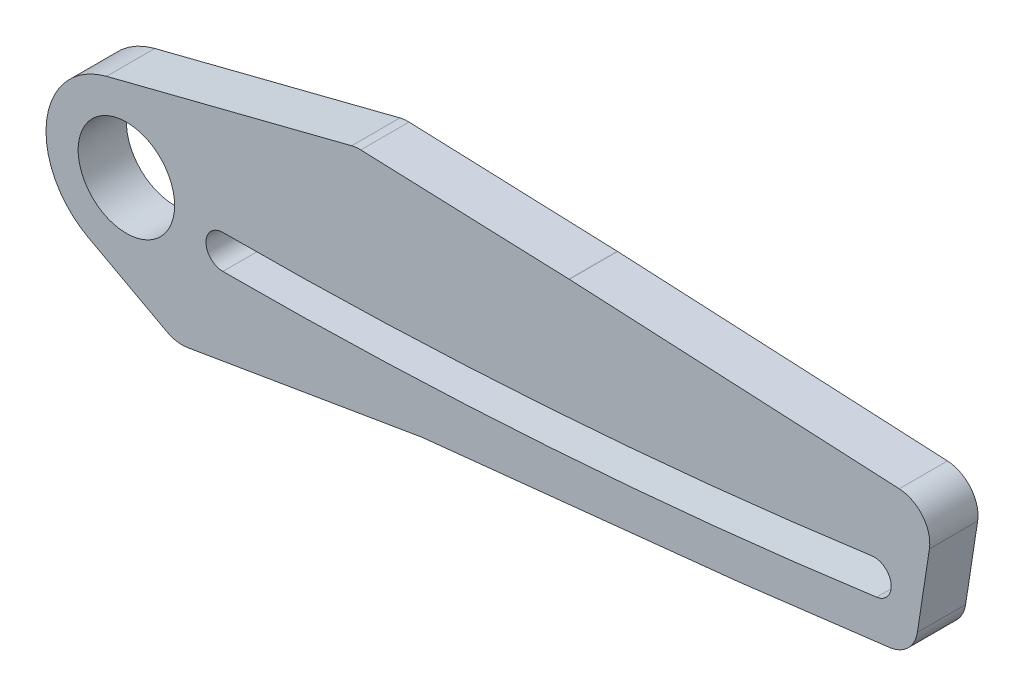
ISO-10303-21;
HEADER;
FILE_DESCRIPTION(('STEP AP214'),'2;1');
FILE_NAME('part.step','',(''),(''),'','','');
FILE_SCHEMA(('AUTOMOTIVE_DESIGN { 1 0 10303 214 1 1 1 1 }'));
ENDSEC;
DATA;
#1=APPLICATION_CONTEXT('core data for automotive mechanical design processes');
#2=APPLICATION_PROTOCOL_DEFINITION('international standard','automotive_design',2000,#1);
#3=PRODUCT_CONTEXT('',#1,'mechanical');
#4=PRODUCT('Part','Part','',(#3));
#5=PRODUCT_RELATED_PRODUCT_CATEGORY('part','',(#4));
#6=PRODUCT_DEFINITION_FORMATION('','',#4);
#7=PRODUCT_DEFINITION_CONTEXT('part definition',#1,'design');
#8=PRODUCT_DEFINITION('design','',#6,#7);
#9=PRODUCT_DEFINITION_SHAPE('','',#8);
#10=(LENGTH_UNIT() NAMED_UNIT(*) SI_UNIT(.MILLI.,.METRE.));
#11=(NAMED_UNIT(*) PLANE_ANGLE_UNIT() SI_UNIT($,.RADIAN.));
#12=(NAMED_UNIT(*) SI_UNIT($,.STERADIAN.) SOLID_ANGLE_UNIT());
#13=UNCERTAINTY_MEASURE_WITH_UNIT(LENGTH_MEASURE(1.E-05),#10,'distance_accuracy_value','');
#14=(GEOMETRIC_REPRESENTATION_CONTEXT(3) GLOBAL_UNCERTAINTY_ASSIGNED_CONTEXT((#13)) GLOBAL_UNIT_ASSIGNED_CONTEXT((#10,
#11,#12)) REPRESENTATION_CONTEXT('',''));
#15=CARTESIAN_POINT('',(0.,0.,0.));
#16=DIRECTION('',(0.,0.,1.));
#17=DIRECTION('',(1.,0.,0.));
#18=AXIS2_PLACEMENT_3D('',#15,#16,#17);
#19=CARTESIAN_POINT('',(0.,0.,1.5));
#20=DIRECTION('',(0.,0.,1.));
#21=DIRECTION('',(1.,0.,0.));
#22=AXIS2_PLACEMENT_3D('',#19,#20,#21);
#23=PLANE('',#22);
#24=CARTESIAN_POINT('',(5.99999999999999,-1.,1.5));
#25=DIRECTION('',(0.,0.,1.));
#26=DIRECTION('',(1.,0.,0.));
#27=AXIS2_PLACEMENT_3D('',#24,#25,#26);
#28=CIRCLE('',#27,1.05);
#29=CARTESIAN_POINT('',(5.99999999999995,0.0499999999999945,1.5));
#30=VERTEX_POINT('',#29);
#31=CARTESIAN_POINT('',(5.99999999999995,-2.05,1.5));
#32=VERTEX_POINT('',#31);
#33=EDGE_CURVE('E202',#30,#32,#28,.T.);
#34=ORIENTED_EDGE('',*,*,#33,.F.);
#35=CARTESIAN_POINT('',(6.,296.061931180591,1.5));
#36=DIRECTION('',(0.,0.,-1.));
#37=DIRECTION('',(1.,0.,0.));
#38=AXIS2_PLACEMENT_3D('',#35,#36,#37);
#39=CIRCLE('',#38,296.011931180591);
#40=CARTESIAN_POINT('',(46.3804692544966,2.81718509969425,1.5));
#41=VERTEX_POINT('',#40);
#42=EDGE_CURVE('E205',#41,#30,#39,.T.);
#43=ORIENTED_EDGE('',*,*,#42,.F.);
#44=CARTESIAN_POINT('',(46.5237050103937,1.77700073227061,1.5));
#45=DIRECTION('',(0.,0.,1.));
#46=DIRECTION('',(1.,0.,0.));
#47=AXIS2_PLACEMENT_3D('',#44,#45,#46);
#48=CIRCLE('',#47,1.04999999999997);
#49=CARTESIAN_POINT('',(46.6669407662909,0.736816364846959,1.5));
#50=VERTEX_POINT('',#49);
#51=EDGE_CURVE('E185',#50,#41,#48,.T.);
#52=ORIENTED_EDGE('',*,*,#51,.F.);
#53=CARTESIAN_POINT('',(6.,296.061931180591,1.5));
#54=DIRECTION('',(0.,0.,1.));
#55=DIRECTION('',(1.,0.,0.));
#56=AXIS2_PLACEMENT_3D('',#53,#54,#55);
#57=CIRCLE('',#56,298.111931180591);
#58=EDGE_CURVE('E196',#32,#50,#57,.T.);
#59=ORIENTED_EDGE('',*,*,#58,.F.);
#60=EDGE_LOOP('',(#34,#43,#52,#59));
#61=FACE_BOUND('',#60,.T.);
#62=DIRECTION('',(-0.999300114895373,0.0374069561725541,0.));
#63=VECTOR('',#62,1.);
#64=CARTESIAN_POINT('',(14.2922695517764,8.79851771367301,1.5));
#65=LINE('',#64,#63);
#66=CARTESIAN_POINT('',(27.5294378481649,8.30300874001141,1.5));
#67=VERTEX_POINT('',#66);
#68=CARTESIAN_POINT('',(14.580779216208,8.78771788666221,1.5));
#69=VERTEX_POINT('',#68);
#70=EDGE_CURVE('E224',#67,#69,#65,.T.);
#71=ORIENTED_EDGE('',*,*,#70,.T.);
#72=CARTESIAN_POINT('',(14.5059653038629,6.78911765687146,1.5));
#73=DIRECTION('',(0.,0.,1.));
#74=DIRECTION('',(1.,0.,0.));
#75=AXIS2_PLACEMENT_3D('',#72,#73,#74);
#76=CIRCLE('',#75,2.);
#77=CARTESIAN_POINT('',(14.0124843293526,8.72728084086716,1.5));
#78=VERTEX_POINT('',#77);
#79=EDGE_CURVE('E644',#69,#78,#76,.T.);
#80=ORIENTED_EDGE('',*,*,#79,.T.);
#81=DIRECTION('',(-0.969081591997847,-0.246740487255168,0.));
#82=VECTOR('',#81,1.);
#83=CARTESIAN_POINT('',(-1.23370243627584,4.84540795998924,1.5));
#84=LINE('',#83,#82);
#85=CARTESIAN_POINT('',(-1.23370243627584,4.84540795998924,1.5));
#86=VERTEX_POINT('',#85);
#87=EDGE_CURVE('E230',#78,#86,#84,.T.);
#88=ORIENTED_EDGE('',*,*,#87,.T.);
#89=CARTESIAN_POINT('',(0.,0.,1.5));
#90=DIRECTION('',(0.,0.,1.));
#91=DIRECTION('',(1.,0.,0.));
#92=AXIS2_PLACEMENT_3D('',#89,#90,#91);
#93=CIRCLE('',#92,5.);
#94=CARTESIAN_POINT('',(-2.37282278086079,-4.40110350373949,1.5));
#95=VERTEX_POINT('',#94);
#96=EDGE_CURVE('E245',#86,#95,#93,.T.);
#97=ORIENTED_EDGE('',*,*,#96,.T.);
#98=DIRECTION('',(0.880220700747899,-0.474564556172158,0.));
#99=VECTOR('',#98,1.);
#100=CARTESIAN_POINT('',(-2.37282278086079,-4.40110350373949,1.5));
#101=LINE('',#100,#99);
#102=CARTESIAN_POINT('',(2.51958718734579,-7.03881057334313,1.5));
#103=VERTEX_POINT('',#102);
#104=EDGE_CURVE('E250',#95,#103,#101,.T.);
#105=ORIENTED_EDGE('',*,*,#104,.T.);
#106=CARTESIAN_POINT('',(3.46871629969011,-5.27836917184733,1.5));
#107=DIRECTION('',(0.,0.,1.));
#108=DIRECTION('',(1.,0.,0.));
#109=AXIS2_PLACEMENT_3D('',#106,#107,#108);
#110=CIRCLE('',#109,2.);
#111=CARTESIAN_POINT('',(3.80141893230588,-7.25050227036034,1.5));
#112=VERTEX_POINT('',#111);
#113=EDGE_CURVE('E277',#103,#112,#110,.T.);
#114=ORIENTED_EDGE('',*,*,#113,.T.);
#115=DIRECTION('',(0.986066549256506,0.166351316307887,0.));
#116=VECTOR('',#115,1.);
#117=CARTESIAN_POINT('',(3.12415373345867,-7.36475820714545,1.5));
#118=LINE('',#117,#116);
#119=CARTESIAN_POINT('',(18.3225468306483,-4.80076016929646,1.5));
#120=VERTEX_POINT('',#119);
#121=EDGE_CURVE('E257',#112,#120,#118,.T.);
#122=ORIENTED_EDGE('',*,*,#121,.T.);
#123=CARTESIAN_POINT('',(18.6552494632641,-6.77289326780947,1.5));
#124=DIRECTION('',(0.,0.,1.));
#125=DIRECTION('',(1.,0.,0.));
#126=AXIS2_PLACEMENT_3D('',#123,#124,#125);
#127=CIRCLE('',#126,2.);
#128=CARTESIAN_POINT('',(18.4469429976877,-4.78377074357949,1.5));
#129=VERTEX_POINT('',#128);
#130=EDGE_CURVE('E12',#120,#129,#127,.F.);
#131=ORIENTED_EDGE('',*,*,#130,.T.);
#132=DIRECTION('',(0.99456126211499,0.104153232788223,0.));
#133=VECTOR('',#132,1.);
#134=CARTESIAN_POINT('',(38.114277377156,-2.72415256421011,1.5));
#135=LINE('',#134,#133);
#136=CARTESIAN_POINT('',(38.0962005888889,-2.72604561595882,1.5));
#137=VERTEX_POINT('',#136);
#138=EDGE_CURVE('E262',#129,#137,#135,.T.);
#139=ORIENTED_EDGE('',*,*,#138,.T.);
#140=CARTESIAN_POINT('',(37.8878941233125,-0.736923091728843,1.5));
#141=DIRECTION('',(0.,0.,1.));
#142=DIRECTION('',(1.,0.,0.));
#143=AXIS2_PLACEMENT_3D('',#140,#141,#142);
#144=CIRCLE('',#143,2.);
#145=CARTESIAN_POINT('',(38.1323167752135,-2.72193129504632,1.5));
#146=VERTEX_POINT('',#145);
#147=EDGE_CURVE('E272',#137,#146,#144,.T.);
#148=ORIENTED_EDGE('',*,*,#147,.T.);
#149=DIRECTION('',(0.992504101658737,0.122211325950516,0.));
#150=VECTOR('',#149,1.);
#151=CARTESIAN_POINT('',(48.9717438907301,-1.38722571738943,1.5));
#152=LINE('',#151,#150);
#153=CARTESIAN_POINT('',(47.4691413970144,-1.57224766624249,1.5));
#154=VERTEX_POINT('',#153);
#155=EDGE_CURVE('E291',#146,#154,#152,.T.);
#156=ORIENTED_EDGE('',*,*,#155,.T.);
#157=CARTESIAN_POINT('',(47.2247187451133,0.412760537074988,1.5));
#158=DIRECTION('',(0.,0.,1.));
#159=DIRECTION('',(1.,0.,0.));
#160=AXIS2_PLACEMENT_3D('',#157,#158,#159);
#161=CIRCLE('',#160,2.);
#162=CARTESIAN_POINT('',(49.2015446519817,0.109182978724819,1.5));
#163=VERTEX_POINT('',#162);
#164=EDGE_CURVE('E276',#154,#163,#161,.T.);
#165=ORIENTED_EDGE('',*,*,#164,.T.);
#166=DIRECTION('',(0.151788779175085,0.98841295343421,0.));
#167=VECTOR('',#166,1.);
#168=CARTESIAN_POINT('',(50.2856916724055,7.16889427120359,1.5));
#169=LINE('',#168,#167);
#170=CARTESIAN_POINT('',(49.9492609586932,4.97813631680483,1.5));
#171=VERTEX_POINT('',#170);
#172=EDGE_CURVE('E288',#163,#171,#169,.T.);
#173=ORIENTED_EDGE('',*,*,#172,.T.);
#174=CARTESIAN_POINT('',(47.9724350518248,5.281713875155,1.5));
#175=DIRECTION('',(0.,0.,1.));
#176=DIRECTION('',(1.,0.,0.));
#177=AXIS2_PLACEMENT_3D('',#174,#175,#176);
#178=CIRCLE('',#177,2.);
#179=CARTESIAN_POINT('',(48.0719999202041,7.27923404701425,1.5));
#180=VERTEX_POINT('',#179);
#181=EDGE_CURVE('E64',#171,#180,#178,.T.);
#182=ORIENTED_EDGE('',*,*,#181,.T.);
#183=DIRECTION('',(-0.998760085929626,0.0497824341896386,0.));
#184=VECTOR('',#183,1.);
#185=CARTESIAN_POINT('',(27.5418166709843,8.3025453616171,1.5));
#186=LINE('',#185,#184);
#187=CARTESIAN_POINT('',(27.5541888041991,8.30192868207992,1.5));
#188=VERTEX_POINT('',#187);
#189=EDGE_CURVE('E231',#180,#188,#186,.T.);
#190=ORIENTED_EDGE('',*,*,#189,.T.);
#191=CARTESIAN_POINT('',(27.4546239358198,6.30440851022067,1.5));
#192=DIRECTION('',(0.,0.,1.));
#193=DIRECTION('',(1.,0.,0.));
#194=AXIS2_PLACEMENT_3D('',#191,#192,#193);
#195=CIRCLE('',#194,2.);
#196=EDGE_CURVE('E642',#188,#67,#195,.T.);
#197=ORIENTED_EDGE('',*,*,#196,.T.);
#198=EDGE_LOOP('',(#71,#80,#88,#97,#105,#114,#122,#131,#139,#148,#156,#165,#173,#182,#190,#197));
#199=FACE_BOUND('',#198,.T.);
#200=CARTESIAN_POINT('',(0.,0.,1.5));
#201=DIRECTION('',(0.,0.,1.));
#202=DIRECTION('',(1.,0.,0.));
#203=AXIS2_PLACEMENT_3D('',#200,#201,#202);
#204=CIRCLE('',#203,3.);
#205=CARTESIAN_POINT('',(3.,0.,1.5));
#206=VERTEX_POINT('',#205);
#207=EDGE_CURVE('E411',#206,#206,#204,.T.);
#208=ORIENTED_EDGE('',*,*,#207,.F.);
#209=EDGE_LOOP('',(#208));
#210=FACE_BOUND('',#209,.T.);
#211=ADVANCED_FACE('F41',(#61,#199,#210),#23,.T.);
#212=CARTESIAN_POINT('',(0.,0.,-1.5));
#213=DIRECTION('',(0.,0.,1.));
#214=DIRECTION('',(1.,0.,0.));
#215=AXIS2_PLACEMENT_3D('',#212,#213,#214);
#216=PLANE('',#215);
#217=CARTESIAN_POINT('',(6.,296.061931180591,-1.5));
#218=DIRECTION('',(0.,0.,1.));
#219=DIRECTION('',(1.,0.,0.));
#220=AXIS2_PLACEMENT_3D('',#217,#218,#219);
#221=CIRCLE('',#220,296.011931180591);
#222=CARTESIAN_POINT('',(46.3804692544966,2.81718509969425,-1.5));
#223=VERTEX_POINT('',#222);
#224=CARTESIAN_POINT('',(5.99999999999995,0.0499999999999945,-1.5));
#225=VERTEX_POINT('',#224);
#226=EDGE_CURVE('E375',#223,#225,#221,.F.);
#227=ORIENTED_EDGE('',*,*,#226,.T.);
#228=CARTESIAN_POINT('',(5.99999999999999,-1.,-1.5));
#229=DIRECTION('',(0.,0.,1.));
#230=DIRECTION('',(1.,0.,0.));
#231=AXIS2_PLACEMENT_3D('',#228,#229,#230);
#232=CIRCLE('',#231,1.05);
#233=CARTESIAN_POINT('',(5.99999999999995,-2.05,-1.5));
#234=VERTEX_POINT('',#233);
#235=EDGE_CURVE('E378',#225,#234,#232,.T.);
#236=ORIENTED_EDGE('',*,*,#235,.T.);
#237=CARTESIAN_POINT('',(6.,296.061931180591,-1.5));
#238=DIRECTION('',(0.,0.,1.));
#239=DIRECTION('',(1.,0.,0.));
#240=AXIS2_PLACEMENT_3D('',#237,#238,#239);
#241=CIRCLE('',#240,298.111931180591);
#242=CARTESIAN_POINT('',(46.6669407662909,0.736816364846959,-1.5));
#243=VERTEX_POINT('',#242);
#244=EDGE_CURVE('E372',#234,#243,#241,.T.);
#245=ORIENTED_EDGE('',*,*,#244,.T.);
#246=CARTESIAN_POINT('',(46.5237050103937,1.77700073227061,-1.5));
#247=DIRECTION('',(0.,0.,1.));
#248=DIRECTION('',(1.,0.,0.));
#249=AXIS2_PLACEMENT_3D('',#246,#247,#248);
#250=CIRCLE('',#249,1.04999999999997);
#251=EDGE_CURVE('E188',#243,#223,#250,.T.);
#252=ORIENTED_EDGE('',*,*,#251,.T.);
#253=EDGE_LOOP('',(#227,#236,#245,#252));
#254=FACE_BOUND('',#253,.T.);
#255=DIRECTION('',(-0.969081591997847,-0.246740487255168,0.));
#256=VECTOR('',#255,1.);
#257=CARTESIAN_POINT('',(-1.23370243627584,4.84540795998924,-1.5));
#258=LINE('',#257,#256);
#259=CARTESIAN_POINT('',(14.0124843293526,8.72728084086716,-1.5));
#260=VERTEX_POINT('',#259);
#261=CARTESIAN_POINT('',(-1.23370243627584,4.84540795998924,-1.5));
#262=VERTEX_POINT('',#261);
#263=EDGE_CURVE('E251',#260,#262,#258,.T.);
#264=ORIENTED_EDGE('',*,*,#263,.F.);
#265=CARTESIAN_POINT('',(14.5059653038629,6.78911765687146,-1.5));
#266=DIRECTION('',(0.,0.,1.));
#267=DIRECTION('',(1.,0.,0.));
#268=AXIS2_PLACEMENT_3D('',#265,#266,#267);
#269=CIRCLE('',#268,2.);
#270=CARTESIAN_POINT('',(14.580779216208,8.78771788666221,-1.5));
#271=VERTEX_POINT('',#270);
#272=EDGE_CURVE('E393',#260,#271,#269,.F.);
#273=ORIENTED_EDGE('',*,*,#272,.T.);
#274=DIRECTION('',(-0.999300114895373,0.0374069561725541,0.));
#275=VECTOR('',#274,1.);
#276=CARTESIAN_POINT('',(14.2922695517764,8.79851771367301,-1.5));
#277=LINE('',#276,#275);
#278=CARTESIAN_POINT('',(27.5294378481649,8.30300874001141,-1.5));
#279=VERTEX_POINT('',#278);
#280=EDGE_CURVE('E363',#279,#271,#277,.T.);
#281=ORIENTED_EDGE('',*,*,#280,.F.);
#282=CARTESIAN_POINT('',(27.4546239358198,6.30440851022067,-1.5));
#283=DIRECTION('',(0.,0.,1.));
#284=DIRECTION('',(1.,0.,0.));
#285=AXIS2_PLACEMENT_3D('',#282,#283,#284);
#286=CIRCLE('',#285,2.);
#287=CARTESIAN_POINT('',(27.5541888041991,8.30192868207992,-1.5));
#288=VERTEX_POINT('',#287);
#289=EDGE_CURVE('E391',#279,#288,#286,.F.);
#290=ORIENTED_EDGE('',*,*,#289,.T.);
#291=DIRECTION('',(-0.998760085929626,0.0497824341896386,0.));
#292=VECTOR('',#291,1.);
#293=CARTESIAN_POINT('',(27.5418166709843,8.3025453616171,-1.5));
#294=LINE('',#293,#292);
#295=CARTESIAN_POINT('',(48.0719999202041,7.27923404701425,-1.5));
#296=VERTEX_POINT('',#295);
#297=EDGE_CURVE('E361',#296,#288,#294,.T.);
#298=ORIENTED_EDGE('',*,*,#297,.F.);
#299=CARTESIAN_POINT('',(47.9724350518248,5.281713875155,-1.5));
#300=DIRECTION('',(0.,0.,1.));
#301=DIRECTION('',(1.,0.,0.));
#302=AXIS2_PLACEMENT_3D('',#299,#300,#301);
#303=CIRCLE('',#302,2.);
#304=CARTESIAN_POINT('',(49.9492609586932,4.97813631680483,-1.5));
#305=VERTEX_POINT('',#304);
#306=EDGE_CURVE('E389',#296,#305,#303,.F.);
#307=ORIENTED_EDGE('',*,*,#306,.T.);
#308=DIRECTION('',(0.151788779175085,0.98841295343421,0.));
#309=VECTOR('',#308,1.);
#310=CARTESIAN_POINT('',(50.2856916724055,7.16889427120359,-1.5));
#311=LINE('',#310,#309);
#312=CARTESIAN_POINT('',(49.2015446519817,0.109182978724819,-1.5));
#313=VERTEX_POINT('',#312);
#314=EDGE_CURVE('E356',#313,#305,#311,.T.);
#315=ORIENTED_EDGE('',*,*,#314,.F.);
#316=CARTESIAN_POINT('',(47.2247187451133,0.412760537074988,-1.5));
#317=DIRECTION('',(0.,0.,1.));
#318=DIRECTION('',(1.,0.,0.));
#319=AXIS2_PLACEMENT_3D('',#316,#317,#318);
#320=CIRCLE('',#319,2.);
#321=CARTESIAN_POINT('',(47.4691413970144,-1.57224766624249,-1.5));
#322=VERTEX_POINT('',#321);
#323=EDGE_CURVE('E387',#313,#322,#320,.F.);
#324=ORIENTED_EDGE('',*,*,#323,.T.);
#325=DIRECTION('',(0.992504101658737,0.122211325950516,0.));
#326=VECTOR('',#325,1.);
#327=CARTESIAN_POINT('',(48.9717438907301,-1.38722571738943,-1.5));
#328=LINE('',#327,#326);
#329=CARTESIAN_POINT('',(38.1323167752135,-2.72193129504632,-1.5));
#330=VERTEX_POINT('',#329);
#331=EDGE_CURVE('E354',#330,#322,#328,.T.);
#332=ORIENTED_EDGE('',*,*,#331,.F.);
#333=CARTESIAN_POINT('',(37.8878941233125,-0.736923091728843,-1.5));
#334=DIRECTION('',(0.,0.,1.));
#335=DIRECTION('',(1.,0.,0.));
#336=AXIS2_PLACEMENT_3D('',#333,#334,#335);
#337=CIRCLE('',#336,2.);
#338=CARTESIAN_POINT('',(38.0962005888889,-2.72604561595882,-1.5));
#339=VERTEX_POINT('',#338);
#340=EDGE_CURVE('E313',#330,#339,#337,.F.);
#341=ORIENTED_EDGE('',*,*,#340,.T.);
#342=DIRECTION('',(0.99456126211499,0.104153232788223,0.));
#343=VECTOR('',#342,1.);
#344=CARTESIAN_POINT('',(38.114277377156,-2.72415256421011,-1.5));
#345=LINE('',#344,#343);
#346=CARTESIAN_POINT('',(18.4469429976877,-4.78377074357949,-1.5));
#347=VERTEX_POINT('',#346);
#348=EDGE_CURVE('E343',#347,#339,#345,.T.);
#349=ORIENTED_EDGE('',*,*,#348,.F.);
#350=CARTESIAN_POINT('',(18.6552494632641,-6.77289326780947,-1.5));
#351=DIRECTION('',(0.,0.,1.));
#352=DIRECTION('',(1.,0.,0.));
#353=AXIS2_PLACEMENT_3D('',#350,#351,#352);
#354=CIRCLE('',#353,2.);
#355=CARTESIAN_POINT('',(18.3225468306483,-4.80076016929646,-1.5));
#356=VERTEX_POINT('',#355);
#357=EDGE_CURVE('E50',#347,#356,#354,.T.);
#358=ORIENTED_EDGE('',*,*,#357,.T.);
#359=DIRECTION('',(0.986066549256506,0.166351316307887,0.));
#360=VECTOR('',#359,1.);
#361=CARTESIAN_POINT('',(3.12415373345867,-7.36475820714545,-1.5));
#362=LINE('',#361,#360);
#363=CARTESIAN_POINT('',(3.80141893230588,-7.25050227036034,-1.5));
#364=VERTEX_POINT('',#363);
#365=EDGE_CURVE('E341',#364,#356,#362,.T.);
#366=ORIENTED_EDGE('',*,*,#365,.F.);
#367=CARTESIAN_POINT('',(3.46871629969011,-5.27836917184733,-1.5));
#368=DIRECTION('',(0.,0.,1.));
#369=DIRECTION('',(1.,0.,0.));
#370=AXIS2_PLACEMENT_3D('',#367,#368,#369);
#371=CIRCLE('',#370,2.);
#372=CARTESIAN_POINT('',(2.51958718734579,-7.03881057334313,-1.5));
#373=VERTEX_POINT('',#372);
#374=EDGE_CURVE('E384',#364,#373,#371,.F.);
#375=ORIENTED_EDGE('',*,*,#374,.T.);
#376=DIRECTION('',(0.880220700747899,-0.474564556172158,0.));
#377=VECTOR('',#376,1.);
#378=CARTESIAN_POINT('',(-2.37282278086079,-4.40110350373949,-1.5));
#379=LINE('',#378,#377);
#380=CARTESIAN_POINT('',(-2.37282278086079,-4.40110350373949,-1.5));
#381=VERTEX_POINT('',#380);
#382=EDGE_CURVE('E350',#381,#373,#379,.T.);
#383=ORIENTED_EDGE('',*,*,#382,.F.);
#384=CARTESIAN_POINT('',(0.,0.,-1.5));
#385=DIRECTION('',(0.,0.,1.));
#386=DIRECTION('',(1.,0.,0.));
#387=AXIS2_PLACEMENT_3D('',#384,#385,#386);
#388=CIRCLE('',#387,5.);
#389=EDGE_CURVE('E238',#262,#381,#388,.T.);
#390=ORIENTED_EDGE('',*,*,#389,.F.);
#391=EDGE_LOOP('',(#264,#273,#281,#290,#298,#307,#315,#324,#332,#341,#349,#358,#366,#375,#383,#390));
#392=FACE_BOUND('',#391,.T.);
#393=CARTESIAN_POINT('',(0.,0.,-1.5));
#394=DIRECTION('',(0.,0.,1.));
#395=DIRECTION('',(1.,0.,0.));
#396=AXIS2_PLACEMENT_3D('',#393,#394,#395);
#397=CIRCLE('',#396,3.);
#398=CARTESIAN_POINT('',(3.,0.,-1.5));
#399=VERTEX_POINT('',#398);
#400=EDGE_CURVE('E252',#399,#399,#397,.T.);
#401=ORIENTED_EDGE('',*,*,#400,.T.);
#402=EDGE_LOOP('',(#401));
#403=FACE_BOUND('',#402,.T.);
#404=ADVANCED_FACE('F339',(#254,#392,#403),#216,.F.);
#405=CARTESIAN_POINT('',(0.,0.,1.5));
#406=DIRECTION('',(0.,0.,-1.));
#407=DIRECTION('',(-1.,0.,0.));
#408=AXIS2_PLACEMENT_3D('',#405,#406,#407);
#409=CYLINDRICAL_SURFACE('',#408,5.);
#410=ORIENTED_EDGE('',*,*,#389,.T.);
#411=DIRECTION('',(0.,0.,-1.));
#412=VECTOR('',#411,1.);
#413=CARTESIAN_POINT('',(-2.37282278086079,-4.40110350373949,1.5));
#414=LINE('',#413,#412);
#415=EDGE_CURVE('E369',#95,#381,#414,.T.);
#416=ORIENTED_EDGE('',*,*,#415,.F.);
#417=ORIENTED_EDGE('',*,*,#96,.F.);
#418=DIRECTION('',(0.,0.,-1.));
#419=VECTOR('',#418,1.);
#420=CARTESIAN_POINT('',(-1.23370243627584,4.84540795998924,1.5));
#421=LINE('',#420,#419);
#422=EDGE_CURVE('E237',#86,#262,#421,.T.);
#423=ORIENTED_EDGE('',*,*,#422,.T.);
#424=EDGE_LOOP('',(#410,#416,#417,#423));
#425=FACE_BOUND('',#424,.T.);
#426=ADVANCED_FACE('F432',(#425),#409,.T.);
#427=CARTESIAN_POINT('',(-2.37282278086079,-4.40110350373949,1.5));
#428=DIRECTION('',(0.474564556172158,0.880220700747899,0.));
#429=DIRECTION('',(-0.880220700747899,0.474564556172158,0.));
#430=AXIS2_PLACEMENT_3D('',#427,#428,#429);
#431=PLANE('',#430);
#432=ORIENTED_EDGE('',*,*,#382,.T.);
#433=DIRECTION('',(0.,0.,-1.));
#434=VECTOR('',#433,1.);
#435=CARTESIAN_POINT('',(2.51958718734579,-7.03881057334313,1.5));
#436=LINE('',#435,#434);
#437=EDGE_CURVE('E333',#373,#103,#436,.F.);
#438=ORIENTED_EDGE('',*,*,#437,.T.);
#439=ORIENTED_EDGE('',*,*,#104,.F.);
#440=ORIENTED_EDGE('',*,*,#415,.T.);
#441=EDGE_LOOP('',(#432,#438,#439,#440));
#442=FACE_BOUND('',#441,.T.);
#443=ADVANCED_FACE('F408',(#442),#431,.F.);
#444=CARTESIAN_POINT('',(3.12415373345867,-7.36475820714545,1.5));
#445=DIRECTION('',(-0.166351316307887,0.986066549256506,0.));
#446=DIRECTION('',(-0.986066549256506,-0.166351316307887,0.));
#447=AXIS2_PLACEMENT_3D('',#444,#445,#446);
#448=PLANE('',#447);
#449=ORIENTED_EDGE('',*,*,#365,.T.);
#450=DIRECTION('',(0.,0.,-1.));
#451=VECTOR('',#450,1.);
#452=CARTESIAN_POINT('',(18.3225468306483,-4.80076016929646,1.5));
#453=LINE('',#452,#451);
#454=EDGE_CURVE('E331',#356,#120,#453,.F.);
#455=ORIENTED_EDGE('',*,*,#454,.T.);
#456=ORIENTED_EDGE('',*,*,#121,.F.);
#457=DIRECTION('',(0.,0.,-1.));
#458=VECTOR('',#457,1.);
#459=CARTESIAN_POINT('',(3.80141893230588,-7.25050227036034,1.5));
#460=LINE('',#459,#458);
#461=EDGE_CURVE('E328',#112,#364,#460,.T.);
#462=ORIENTED_EDGE('',*,*,#461,.T.);
#463=EDGE_LOOP('',(#449,#455,#456,#462));
#464=FACE_BOUND('',#463,.T.);
#465=ADVANCED_FACE('F347',(#464),#448,.F.);
#466=CARTESIAN_POINT('',(38.114277377156,-2.72415256421011,1.5));
#467=DIRECTION('',(-0.104153232788223,0.99456126211499,0.));
#468=DIRECTION('',(-0.99456126211499,-0.104153232788223,0.));
#469=AXIS2_PLACEMENT_3D('',#466,#467,#468);
#470=PLANE('',#469);
#471=ORIENTED_EDGE('',*,*,#348,.T.);
#472=DIRECTION('',(0.,0.,-1.));
#473=VECTOR('',#472,1.);
#474=CARTESIAN_POINT('',(38.0962005888889,-2.72604561595882,1.5));
#475=LINE('',#474,#473);
#476=EDGE_CURVE('E310',#339,#137,#475,.F.);
#477=ORIENTED_EDGE('',*,*,#476,.T.);
#478=ORIENTED_EDGE('',*,*,#138,.F.);
#479=DIRECTION('',(0.,0.,-1.));
#480=VECTOR('',#479,1.);
#481=CARTESIAN_POINT('',(18.4469429976877,-4.78377074357949,-1.5));
#482=LINE('',#481,#480);
#483=EDGE_CURVE('E320',#129,#347,#482,.T.);
#484=ORIENTED_EDGE('',*,*,#483,.T.);
#485=EDGE_LOOP('',(#471,#477,#478,#484));
#486=FACE_BOUND('',#485,.T.);
#487=ADVANCED_FACE('F353',(#486),#470,.F.);
#488=CARTESIAN_POINT('',(48.9717438907301,-1.38722571738943,1.5));
#489=DIRECTION('',(-0.122211325950516,0.992504101658737,0.));
#490=DIRECTION('',(-0.992504101658737,-0.122211325950516,0.));
#491=AXIS2_PLACEMENT_3D('',#488,#489,#490);
#492=PLANE('',#491);
#493=ORIENTED_EDGE('',*,*,#331,.T.);
#494=DIRECTION('',(0.,0.,-1.));
#495=VECTOR('',#494,1.);
#496=CARTESIAN_POINT('',(47.4691413970144,-1.57224766624249,1.5));
#497=LINE('',#496,#495);
#498=EDGE_CURVE('E317',#322,#154,#497,.F.);
#499=ORIENTED_EDGE('',*,*,#498,.T.);
#500=ORIENTED_EDGE('',*,*,#155,.F.);
#501=DIRECTION('',(0.,0.,-1.));
#502=VECTOR('',#501,1.);
#503=CARTESIAN_POINT('',(38.1323167752135,-2.72193129504632,1.5));
#504=LINE('',#503,#502);
#505=EDGE_CURVE('E312',#146,#330,#504,.T.);
#506=ORIENTED_EDGE('',*,*,#505,.T.);
#507=EDGE_LOOP('',(#493,#499,#500,#506));
#508=FACE_BOUND('',#507,.T.);
#509=ADVANCED_FACE('F456',(#508),#492,.F.);
#510=CARTESIAN_POINT('',(50.2856916724055,7.16889427120359,1.5));
#511=DIRECTION('',(-0.98841295343421,0.151788779175085,0.));
#512=DIRECTION('',(-0.151788779175085,-0.98841295343421,0.));
#513=AXIS2_PLACEMENT_3D('',#510,#511,#512);
#514=PLANE('',#513);
#515=ORIENTED_EDGE('',*,*,#314,.T.);
#516=DIRECTION('',(0.,0.,-1.));
#517=VECTOR('',#516,1.);
#518=CARTESIAN_POINT('',(49.9492609586932,4.97813631680483,1.5));
#519=LINE('',#518,#517);
#520=EDGE_CURVE('E318',#305,#171,#519,.F.);
#521=ORIENTED_EDGE('',*,*,#520,.T.);
#522=ORIENTED_EDGE('',*,*,#172,.F.);
#523=DIRECTION('',(0.,0.,-1.));
#524=VECTOR('',#523,1.);
#525=CARTESIAN_POINT('',(49.2015446519817,0.109182978724818,1.5));
#526=LINE('',#525,#524);
#527=EDGE_CURVE('E322',#163,#313,#526,.T.);
#528=ORIENTED_EDGE('',*,*,#527,.T.);
#529=EDGE_LOOP('',(#515,#521,#522,#528));
#530=FACE_BOUND('',#529,.T.);
#531=ADVANCED_FACE('F453',(#530),#514,.F.);
#532=CARTESIAN_POINT('',(27.5418166709843,8.3025453616171,1.5));
#533=DIRECTION('',(-0.0497824341896386,-0.998760085929626,0.));
#534=DIRECTION('',(0.998760085929626,-0.0497824341896386,0.));
#535=AXIS2_PLACEMENT_3D('',#532,#533,#534);
#536=PLANE('',#535);
#537=ORIENTED_EDGE('',*,*,#297,.T.);
#538=DIRECTION('',(0.,0.,-1.));
#539=VECTOR('',#538,1.);
#540=CARTESIAN_POINT('',(27.5541888041991,8.30192868207992,1.5));
#541=LINE('',#540,#539);
#542=EDGE_CURVE('E57',#288,#188,#541,.F.);
#543=ORIENTED_EDGE('',*,*,#542,.T.);
#544=ORIENTED_EDGE('',*,*,#189,.F.);
#545=DIRECTION('',(0.,0.,-1.));
#546=VECTOR('',#545,1.);
#547=CARTESIAN_POINT('',(48.0719999202041,7.27923404701425,1.5));
#548=LINE('',#547,#546);
#549=EDGE_CURVE('E640',#180,#296,#548,.T.);
#550=ORIENTED_EDGE('',*,*,#549,.T.);
#551=EDGE_LOOP('',(#537,#543,#544,#550));
#552=FACE_BOUND('',#551,.T.);
#553=ADVANCED_FACE('F450',(#552),#536,.F.);
#554=CARTESIAN_POINT('',(14.2922695517764,8.79851771367301,1.5));
#555=DIRECTION('',(-0.0374069561725541,-0.999300114895372,0.));
#556=DIRECTION('',(0.999300114895373,-0.0374069561725541,0.));
#557=AXIS2_PLACEMENT_3D('',#554,#555,#556);
#558=PLANE('',#557);
#559=ORIENTED_EDGE('',*,*,#280,.T.);
#560=DIRECTION('',(0.,0.,-1.));
#561=VECTOR('',#560,1.);
#562=CARTESIAN_POINT('',(14.580779216208,8.78771788666221,1.5));
#563=LINE('',#562,#561);
#564=EDGE_CURVE('E397',#271,#69,#563,.F.);
#565=ORIENTED_EDGE('',*,*,#564,.T.);
#566=ORIENTED_EDGE('',*,*,#70,.F.);
#567=DIRECTION('',(0.,0.,-1.));
#568=VECTOR('',#567,1.);
#569=CARTESIAN_POINT('',(27.5294378481649,8.30300874001141,1.5));
#570=LINE('',#569,#568);
#571=EDGE_CURVE('E395',#67,#279,#570,.T.);
#572=ORIENTED_EDGE('',*,*,#571,.T.);
#573=EDGE_LOOP('',(#559,#565,#566,#572));
#574=FACE_BOUND('',#573,.T.);
#575=ADVANCED_FACE('F446',(#574),#558,.F.);
#576=CARTESIAN_POINT('',(-1.23370243627584,4.84540795998924,1.5));
#577=DIRECTION('',(0.246740487255168,-0.969081591997847,0.));
#578=DIRECTION('',(0.969081591997847,0.246740487255168,0.));
#579=AXIS2_PLACEMENT_3D('',#576,#577,#578);
#580=PLANE('',#579);
#581=ORIENTED_EDGE('',*,*,#87,.F.);
#582=DIRECTION('',(0.,0.,-1.));
#583=VECTOR('',#582,1.);
#584=CARTESIAN_POINT('',(14.0124843293526,8.72728084086716,1.5));
#585=LINE('',#584,#583);
#586=EDGE_CURVE('E381',#78,#260,#585,.T.);
#587=ORIENTED_EDGE('',*,*,#586,.T.);
#588=ORIENTED_EDGE('',*,*,#263,.T.);
#589=ORIENTED_EDGE('',*,*,#422,.F.);
#590=EDGE_LOOP('',(#581,#587,#588,#589));
#591=FACE_BOUND('',#590,.T.);
#592=ADVANCED_FACE('F442',(#591),#580,.F.);
#593=CARTESIAN_POINT('',(0.,0.,1.5));
#594=DIRECTION('',(0.,0.,-1.));
#595=DIRECTION('',(-1.,0.,0.));
#596=AXIS2_PLACEMENT_3D('',#593,#594,#595);
#597=CYLINDRICAL_SURFACE('',#596,3.);
#598=ORIENTED_EDGE('',*,*,#207,.T.);
#599=EDGE_LOOP('',(#598));
#600=FACE_BOUND('',#599,.T.);
#601=ORIENTED_EDGE('',*,*,#400,.F.);
#602=EDGE_LOOP('',(#601));
#603=FACE_BOUND('',#602,.T.);
#604=ADVANCED_FACE('F445',(#600,#603),#597,.F.);
#605=CARTESIAN_POINT('',(5.99999999999999,-1.,-20.5));
#606=DIRECTION('',(0.,0.,1.));
#607=DIRECTION('',(1.,0.,0.));
#608=AXIS2_PLACEMENT_3D('',#605,#606,#607);
#609=CYLINDRICAL_SURFACE('',#608,1.05);
#610=DIRECTION('',(0.,0.,1.));
#611=VECTOR('',#610,1.);
#612=CARTESIAN_POINT('',(5.99999999999995,0.0499999999999945,-20.5));
#613=LINE('',#612,#611);
#614=EDGE_CURVE('E419',#225,#30,#613,.T.);
#615=ORIENTED_EDGE('',*,*,#614,.T.);
#616=ORIENTED_EDGE('',*,*,#33,.T.);
#617=DIRECTION('',(0.,0.,1.));
#618=VECTOR('',#617,1.);
#619=CARTESIAN_POINT('',(5.99999999999995,-2.05,-20.5));
#620=LINE('',#619,#618);
#621=EDGE_CURVE('E192',#234,#32,#620,.T.);
#622=ORIENTED_EDGE('',*,*,#621,.F.);
#623=ORIENTED_EDGE('',*,*,#235,.F.);
#624=EDGE_LOOP('',(#615,#616,#622,#623));
#625=FACE_BOUND('',#624,.T.);
#626=ADVANCED_FACE('F425',(#625),#609,.F.);
#627=CARTESIAN_POINT('',(6.,296.061931180591,-20.5));
#628=DIRECTION('',(0.,0.,1.));
#629=DIRECTION('',(1.,0.,0.));
#630=AXIS2_PLACEMENT_3D('',#627,#628,#629);
#631=CYLINDRICAL_SURFACE('',#630,296.011931180591);
#632=DIRECTION('',(0.,0.,1.));
#633=VECTOR('',#632,1.);
#634=CARTESIAN_POINT('',(46.3804692544966,2.81718509969425,-20.5));
#635=LINE('',#634,#633);
#636=EDGE_CURVE('E191',#223,#41,#635,.T.);
#637=ORIENTED_EDGE('',*,*,#636,.T.);
#638=ORIENTED_EDGE('',*,*,#42,.T.);
#639=ORIENTED_EDGE('',*,*,#614,.F.);
#640=ORIENTED_EDGE('',*,*,#226,.F.);
#641=EDGE_LOOP('',(#637,#638,#639,#640));
#642=FACE_BOUND('',#641,.T.);
#643=ADVANCED_FACE('F427',(#642),#631,.T.);
#644=CARTESIAN_POINT('',(46.5237050103937,1.77700073227061,-20.5));
#645=DIRECTION('',(0.,0.,1.));
#646=DIRECTION('',(1.,0.,0.));
#647=AXIS2_PLACEMENT_3D('',#644,#645,#646);
#648=CYLINDRICAL_SURFACE('',#647,1.04999999999997);
#649=DIRECTION('',(0.,0.,1.));
#650=VECTOR('',#649,1.);
#651=CARTESIAN_POINT('',(46.6669407662909,0.736816364846959,-20.5));
#652=LINE('',#651,#650);
#653=EDGE_CURVE('E180',#243,#50,#652,.T.);
#654=ORIENTED_EDGE('',*,*,#653,.T.);
#655=ORIENTED_EDGE('',*,*,#51,.T.);
#656=ORIENTED_EDGE('',*,*,#636,.F.);
#657=ORIENTED_EDGE('',*,*,#251,.F.);
#658=EDGE_LOOP('',(#654,#655,#656,#657));
#659=FACE_BOUND('',#658,.T.);
#660=ADVANCED_FACE('F182',(#659),#648,.F.);
#661=CARTESIAN_POINT('',(6.,296.061931180591,-20.5));
#662=DIRECTION('',(0.,0.,1.));
#663=DIRECTION('',(1.,0.,0.));
#664=AXIS2_PLACEMENT_3D('',#661,#662,#663);
#665=CYLINDRICAL_SURFACE('',#664,298.111931180591);
#666=ORIENTED_EDGE('',*,*,#621,.T.);
#667=ORIENTED_EDGE('',*,*,#58,.T.);
#668=ORIENTED_EDGE('',*,*,#653,.F.);
#669=ORIENTED_EDGE('',*,*,#244,.F.);
#670=EDGE_LOOP('',(#666,#667,#668,#669));
#671=FACE_BOUND('',#670,.T.);
#672=ADVANCED_FACE('F197',(#671),#665,.F.);
#673=CARTESIAN_POINT('',(14.5059653038629,6.78911765687146,1.5));
#674=DIRECTION('',(0.,0.,-1.));
#675=DIRECTION('',(-1.,0.,0.));
#676=AXIS2_PLACEMENT_3D('',#673,#674,#675);
#677=CYLINDRICAL_SURFACE('',#676,2.);
#678=ORIENTED_EDGE('',*,*,#79,.F.);
#679=ORIENTED_EDGE('',*,*,#564,.F.);
#680=ORIENTED_EDGE('',*,*,#272,.F.);
#681=ORIENTED_EDGE('',*,*,#586,.F.);
#682=EDGE_LOOP('',(#678,#679,#680,#681));
#683=FACE_BOUND('',#682,.T.);
#684=ADVANCED_FACE('F466',(#683),#677,.T.);
#685=CARTESIAN_POINT('',(27.4546239358198,6.30440851022067,1.5));
#686=DIRECTION('',(0.,0.,-1.));
#687=DIRECTION('',(-1.,0.,0.));
#688=AXIS2_PLACEMENT_3D('',#685,#686,#687);
#689=CYLINDRICAL_SURFACE('',#688,2.);
#690=ORIENTED_EDGE('',*,*,#196,.F.);
#691=ORIENTED_EDGE('',*,*,#542,.F.);
#692=ORIENTED_EDGE('',*,*,#289,.F.);
#693=ORIENTED_EDGE('',*,*,#571,.F.);
#694=EDGE_LOOP('',(#690,#691,#692,#693));
#695=FACE_BOUND('',#694,.T.);
#696=ADVANCED_FACE('F469',(#695),#689,.T.);
#697=CARTESIAN_POINT('',(47.9724350518248,5.281713875155,1.5));
#698=DIRECTION('',(0.,0.,-1.));
#699=DIRECTION('',(-1.,0.,0.));
#700=AXIS2_PLACEMENT_3D('',#697,#698,#699);
#701=CYLINDRICAL_SURFACE('',#700,2.);
#702=ORIENTED_EDGE('',*,*,#181,.F.);
#703=ORIENTED_EDGE('',*,*,#520,.F.);
#704=ORIENTED_EDGE('',*,*,#306,.F.);
#705=ORIENTED_EDGE('',*,*,#549,.F.);
#706=EDGE_LOOP('',(#702,#703,#704,#705));
#707=FACE_BOUND('',#706,.T.);
#708=ADVANCED_FACE('F473',(#707),#701,.T.);
#709=CARTESIAN_POINT('',(47.2247187451133,0.412760537074988,1.5));
#710=DIRECTION('',(0.,0.,-1.));
#711=DIRECTION('',(-1.,0.,0.));
#712=AXIS2_PLACEMENT_3D('',#709,#710,#711);
#713=CYLINDRICAL_SURFACE('',#712,2.);
#714=ORIENTED_EDGE('',*,*,#164,.F.);
#715=ORIENTED_EDGE('',*,*,#498,.F.);
#716=ORIENTED_EDGE('',*,*,#323,.F.);
#717=ORIENTED_EDGE('',*,*,#527,.F.);
#718=EDGE_LOOP('',(#714,#715,#716,#717));
#719=FACE_BOUND('',#718,.T.);
#720=ADVANCED_FACE('F477',(#719),#713,.T.);
#721=CARTESIAN_POINT('',(37.8878941233125,-0.736923091728843,1.5));
#722=DIRECTION('',(0.,0.,-1.));
#723=DIRECTION('',(-1.,0.,0.));
#724=AXIS2_PLACEMENT_3D('',#721,#722,#723);
#725=CYLINDRICAL_SURFACE('',#724,2.);
#726=ORIENTED_EDGE('',*,*,#147,.F.);
#727=ORIENTED_EDGE('',*,*,#476,.F.);
#728=ORIENTED_EDGE('',*,*,#340,.F.);
#729=ORIENTED_EDGE('',*,*,#505,.F.);
#730=EDGE_LOOP('',(#726,#727,#728,#729));
#731=FACE_BOUND('',#730,.T.);
#732=ADVANCED_FACE('F309',(#731),#725,.T.);
#733=CARTESIAN_POINT('',(18.6552494632641,-6.77289326780947,1.5));
#734=DIRECTION('',(0.,0.,1.));
#735=DIRECTION('',(1.,0.,0.));
#736=AXIS2_PLACEMENT_3D('',#733,#734,#735);
#737=CYLINDRICAL_SURFACE('',#736,2.);
#738=ORIENTED_EDGE('',*,*,#130,.F.);
#739=ORIENTED_EDGE('',*,*,#454,.F.);
#740=ORIENTED_EDGE('',*,*,#357,.F.);
#741=ORIENTED_EDGE('',*,*,#483,.F.);
#742=EDGE_LOOP('',(#738,#739,#740,#741));
#743=FACE_BOUND('',#742,.T.);
#744=ADVANCED_FACE('F352',(#743),#737,.F.);
#745=CARTESIAN_POINT('',(3.46871629969011,-5.27836917184733,1.5));
#746=DIRECTION('',(0.,0.,-1.));
#747=DIRECTION('',(-1.,0.,0.));
#748=AXIS2_PLACEMENT_3D('',#745,#746,#747);
#749=CYLINDRICAL_SURFACE('',#748,2.);
#750=ORIENTED_EDGE('',*,*,#113,.F.);
#751=ORIENTED_EDGE('',*,*,#437,.F.);
#752=ORIENTED_EDGE('',*,*,#374,.F.);
#753=ORIENTED_EDGE('',*,*,#461,.F.);
#754=EDGE_LOOP('',(#750,#751,#752,#753));
#755=FACE_BOUND('',#754,.T.);
#756=ADVANCED_FACE('F43',(#755),#749,.T.);
#757=CLOSED_SHELL('',(#211,#404,#426,#443,#465,#487,#509,#531,#553,#575,#592,#604,#626,#643,
#660,#672,#684,#696,#708,#720,#732,#744,#756));
#758=MANIFOLD_SOLID_BREP('B2',#757);
#759=ADVANCED_BREP_SHAPE_REPRESENTATION('',(#18,#758),#14);
#760=SHAPE_DEFINITION_REPRESENTATION(#9,#759);
ENDSEC;
END-ISO-10303-21;
